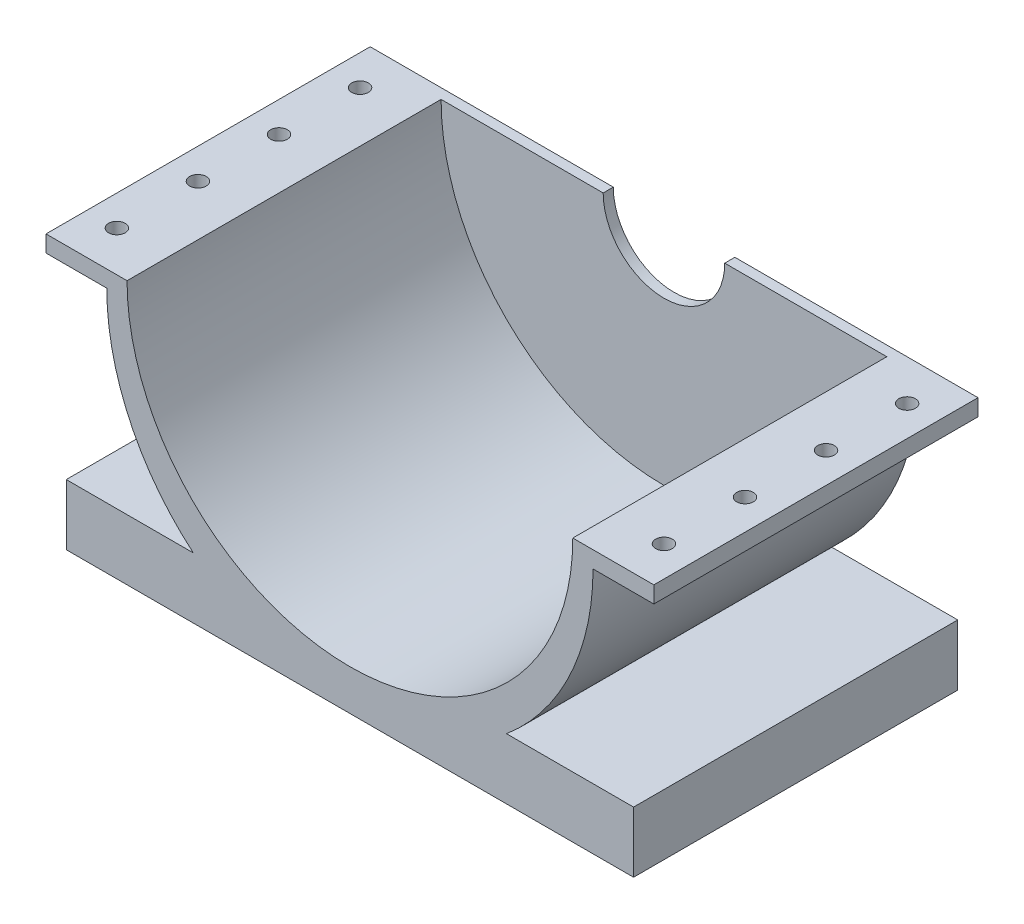
ISO-10303-21;
HEADER;
FILE_DESCRIPTION(('STEP AP214'),'2;1');
FILE_NAME('part.step','',(''),(''),'','','');
FILE_SCHEMA(('AUTOMOTIVE_DESIGN { 1 0 10303 214 1 1 1 1 }'));
ENDSEC;
DATA;
#1=APPLICATION_CONTEXT('core data for automotive mechanical design processes');
#2=APPLICATION_PROTOCOL_DEFINITION('international standard','automotive_design',2000,#1);
#3=PRODUCT_CONTEXT('',#1,'mechanical');
#4=PRODUCT('Part','Part','',(#3));
#5=PRODUCT_RELATED_PRODUCT_CATEGORY('part','',(#4));
#6=PRODUCT_DEFINITION_FORMATION('','',#4);
#7=PRODUCT_DEFINITION_CONTEXT('part definition',#1,'design');
#8=PRODUCT_DEFINITION('design','',#6,#7);
#9=PRODUCT_DEFINITION_SHAPE('','',#8);
#10=(LENGTH_UNIT() NAMED_UNIT(*) SI_UNIT(.MILLI.,.METRE.));
#11=(NAMED_UNIT(*) PLANE_ANGLE_UNIT() SI_UNIT($,.RADIAN.));
#12=(NAMED_UNIT(*) SI_UNIT($,.STERADIAN.) SOLID_ANGLE_UNIT());
#13=UNCERTAINTY_MEASURE_WITH_UNIT(LENGTH_MEASURE(1.E-05),#10,'distance_accuracy_value','');
#14=(GEOMETRIC_REPRESENTATION_CONTEXT(3) GLOBAL_UNCERTAINTY_ASSIGNED_CONTEXT((#13)) GLOBAL_UNIT_ASSIGNED_CONTEXT((#10,
#11,#12)) REPRESENTATION_CONTEXT('',''));
#15=CARTESIAN_POINT('',(0.,0.,0.));
#16=DIRECTION('',(0.,0.,1.));
#17=DIRECTION('',(1.,0.,0.));
#18=AXIS2_PLACEMENT_3D('',#15,#16,#17);
#19=CARTESIAN_POINT('',(7.5,0.41,4.));
#20=DIRECTION('',(0.,-1.,0.));
#21=DIRECTION('',(1.,0.,0.));
#22=AXIS2_PLACEMENT_3D('',#19,#20,#21);
#23=PLANE('',#22);
#24=CARTESIAN_POINT('',(-6.75,0.41,-1.));
#25=DIRECTION('',(0.,-1.,0.));
#26=DIRECTION('',(1.,0.,0.));
#27=AXIS2_PLACEMENT_3D('',#24,#25,#26);
#28=CIRCLE('',#27,0.205000000000001);
#29=CARTESIAN_POINT('',(-6.545,0.41,-1.));
#30=VERTEX_POINT('',#29);
#31=EDGE_CURVE('E233',#30,#30,#28,.T.);
#32=ORIENTED_EDGE('',*,*,#31,.T.);
#33=EDGE_LOOP('',(#32));
#34=FACE_BOUND('',#33,.T.);
#35=CARTESIAN_POINT('',(-6.75,0.41,1.));
#36=DIRECTION('',(0.,-1.,0.));
#37=DIRECTION('',(1.,0.,0.));
#38=AXIS2_PLACEMENT_3D('',#35,#36,#37);
#39=CIRCLE('',#38,0.205000000000001);
#40=CARTESIAN_POINT('',(-6.545,0.41,1.));
#41=VERTEX_POINT('',#40);
#42=EDGE_CURVE('E573',#41,#41,#39,.T.);
#43=ORIENTED_EDGE('',*,*,#42,.T.);
#44=EDGE_LOOP('',(#43));
#45=FACE_BOUND('',#44,.T.);
#46=CARTESIAN_POINT('',(-6.75,0.41,3.));
#47=DIRECTION('',(0.,-1.,0.));
#48=DIRECTION('',(1.,0.,0.));
#49=AXIS2_PLACEMENT_3D('',#46,#47,#48);
#50=CIRCLE('',#49,0.205000000000001);
#51=CARTESIAN_POINT('',(-6.545,0.41,3.));
#52=VERTEX_POINT('',#51);
#53=EDGE_CURVE('E246',#52,#52,#50,.T.);
#54=ORIENTED_EDGE('',*,*,#53,.T.);
#55=EDGE_LOOP('',(#54));
#56=FACE_BOUND('',#55,.T.);
#57=CARTESIAN_POINT('',(-6.75,0.41,-3.));
#58=DIRECTION('',(0.,-1.,0.));
#59=DIRECTION('',(1.,0.,0.));
#60=AXIS2_PLACEMENT_3D('',#57,#58,#59);
#61=CIRCLE('',#60,0.205000000000001);
#62=CARTESIAN_POINT('',(-6.545,0.41,-3.));
#63=VERTEX_POINT('',#62);
#64=EDGE_CURVE('E229',#63,#63,#61,.T.);
#65=ORIENTED_EDGE('',*,*,#64,.T.);
#66=EDGE_LOOP('',(#65));
#67=FACE_BOUND('',#66,.T.);
#68=DIRECTION('',(-1.,0.,0.));
#69=VECTOR('',#68,1.);
#70=CARTESIAN_POINT('',(-5.5,0.41,-3.75));
#71=LINE('',#70,#69);
#72=CARTESIAN_POINT('',(-1.5,0.41,-3.75));
#73=VERTEX_POINT('',#72);
#74=CARTESIAN_POINT('',(-5.5,0.41,-3.75));
#75=VERTEX_POINT('',#74);
#76=EDGE_CURVE('E161',#73,#75,#71,.T.);
#77=ORIENTED_EDGE('',*,*,#76,.F.);
#78=DIRECTION('',(0.,0.,-1.));
#79=VECTOR('',#78,1.);
#80=CARTESIAN_POINT('',(-1.5,0.409999999999999,3.75));
#81=LINE('',#80,#79);
#82=CARTESIAN_POINT('',(-1.5,0.409999999999999,-4.));
#83=VERTEX_POINT('',#82);
#84=EDGE_CURVE('E49',#73,#83,#81,.T.);
#85=ORIENTED_EDGE('',*,*,#84,.T.);
#86=DIRECTION('',(-1.,0.,0.));
#87=VECTOR('',#86,1.);
#88=CARTESIAN_POINT('',(7.5,0.41,-4.));
#89=LINE('',#88,#87);
#90=CARTESIAN_POINT('',(-7.5,0.409999999999998,-4.));
#91=VERTEX_POINT('',#90);
#92=EDGE_CURVE('E159',#83,#91,#89,.T.);
#93=ORIENTED_EDGE('',*,*,#92,.T.);
#94=DIRECTION('',(0.,0.,-1.));
#95=VECTOR('',#94,1.);
#96=CARTESIAN_POINT('',(-7.5,0.409999999999998,4.));
#97=LINE('',#96,#95);
#98=CARTESIAN_POINT('',(-7.5,0.409999999999998,4.));
#99=VERTEX_POINT('',#98);
#100=EDGE_CURVE('E215',#99,#91,#97,.T.);
#101=ORIENTED_EDGE('',*,*,#100,.F.);
#102=DIRECTION('',(-1.,0.,0.));
#103=VECTOR('',#102,1.);
#104=CARTESIAN_POINT('',(7.5,0.41,4.));
#105=LINE('',#104,#103);
#106=CARTESIAN_POINT('',(-5.5,0.409999999999998,4.));
#107=VERTEX_POINT('',#106);
#108=EDGE_CURVE('E290',#107,#99,#105,.T.);
#109=ORIENTED_EDGE('',*,*,#108,.F.);
#110=DIRECTION('',(0.,0.,1.));
#111=VECTOR('',#110,1.);
#112=CARTESIAN_POINT('',(-5.5,0.41,-3.75));
#113=LINE('',#112,#111);
#114=EDGE_CURVE('E57',#75,#107,#113,.T.);
#115=ORIENTED_EDGE('',*,*,#114,.F.);
#116=EDGE_LOOP('',(#77,#85,#93,#101,#109,#115));
#117=FACE_BOUND('',#116,.T.);
#118=ADVANCED_FACE('F33',(#34,#45,#56,#67,#117),#23,.F.);
#119=CARTESIAN_POINT('',(0.,0.,4.));
#120=DIRECTION('',(0.,0.,-1.));
#121=DIRECTION('',(-1.,0.,0.));
#122=AXIS2_PLACEMENT_3D('',#119,#120,#121);
#123=CYLINDRICAL_SURFACE('',#122,6.);
#124=CARTESIAN_POINT('',(0.,0.,-4.));
#125=DIRECTION('',(0.,0.,1.));
#126=DIRECTION('',(1.,0.,0.));
#127=AXIS2_PLACEMENT_3D('',#124,#125,#126);
#128=CIRCLE('',#127,6.);
#129=CARTESIAN_POINT('',(3.8641816727478,-4.59,-4.));
#130=VERTEX_POINT('',#129);
#131=CARTESIAN_POINT('',(6.,0.,-4.));
#132=VERTEX_POINT('',#131);
#133=EDGE_CURVE('E281',#130,#132,#128,.T.);
#134=ORIENTED_EDGE('',*,*,#133,.T.);
#135=DIRECTION('',(0.,0.,-1.));
#136=VECTOR('',#135,1.);
#137=CARTESIAN_POINT('',(6.,0.,4.));
#138=LINE('',#137,#136);
#139=CARTESIAN_POINT('',(6.,0.,4.));
#140=VERTEX_POINT('',#139);
#141=EDGE_CURVE('E42',#140,#132,#138,.T.);
#142=ORIENTED_EDGE('',*,*,#141,.F.);
#143=CARTESIAN_POINT('',(0.,0.,4.));
#144=DIRECTION('',(0.,0.,1.));
#145=DIRECTION('',(1.,0.,0.));
#146=AXIS2_PLACEMENT_3D('',#143,#144,#145);
#147=CIRCLE('',#146,6.);
#148=CARTESIAN_POINT('',(3.8641816727478,-4.59,4.));
#149=VERTEX_POINT('',#148);
#150=EDGE_CURVE('E189',#149,#140,#147,.T.);
#151=ORIENTED_EDGE('',*,*,#150,.F.);
#152=DIRECTION('',(0.,0.,-1.));
#153=VECTOR('',#152,1.);
#154=CARTESIAN_POINT('',(3.8641816727478,-4.59,4.));
#155=LINE('',#154,#153);
#156=EDGE_CURVE('E190',#149,#130,#155,.T.);
#157=ORIENTED_EDGE('',*,*,#156,.T.);
#158=EDGE_LOOP('',(#134,#142,#151,#157));
#159=FACE_BOUND('',#158,.T.);
#160=ADVANCED_FACE('F35',(#159),#123,.T.);
#161=CARTESIAN_POINT('',(7.5,0.,4.));
#162=DIRECTION('',(0.,1.,0.));
#163=DIRECTION('',(-1.,0.,0.));
#164=AXIS2_PLACEMENT_3D('',#161,#162,#163);
#165=PLANE('',#164);
#166=CARTESIAN_POINT('',(6.75,0.,-1.));
#167=DIRECTION('',(0.,1.,0.));
#168=DIRECTION('',(-1.,0.,0.));
#169=AXIS2_PLACEMENT_3D('',#166,#167,#168);
#170=CIRCLE('',#169,0.205000000000001);
#171=CARTESIAN_POINT('',(6.545,0.,-1.));
#172=VERTEX_POINT('',#171);
#173=EDGE_CURVE('E262',#172,#172,#170,.T.);
#174=ORIENTED_EDGE('',*,*,#173,.T.);
#175=EDGE_LOOP('',(#174));
#176=FACE_BOUND('',#175,.T.);
#177=CARTESIAN_POINT('',(6.75,0.,1.));
#178=DIRECTION('',(0.,1.,0.));
#179=DIRECTION('',(-1.,0.,0.));
#180=AXIS2_PLACEMENT_3D('',#177,#178,#179);
#181=CIRCLE('',#180,0.205000000000001);
#182=CARTESIAN_POINT('',(6.545,0.,1.));
#183=VERTEX_POINT('',#182);
#184=EDGE_CURVE('E259',#183,#183,#181,.T.);
#185=ORIENTED_EDGE('',*,*,#184,.T.);
#186=EDGE_LOOP('',(#185));
#187=FACE_BOUND('',#186,.T.);
#188=CARTESIAN_POINT('',(6.75,0.,3.));
#189=DIRECTION('',(0.,1.,0.));
#190=DIRECTION('',(-1.,0.,0.));
#191=AXIS2_PLACEMENT_3D('',#188,#189,#190);
#192=CIRCLE('',#191,0.205000000000001);
#193=CARTESIAN_POINT('',(6.545,0.,3.));
#194=VERTEX_POINT('',#193);
#195=EDGE_CURVE('E251',#194,#194,#192,.T.);
#196=ORIENTED_EDGE('',*,*,#195,.T.);
#197=EDGE_LOOP('',(#196));
#198=FACE_BOUND('',#197,.T.);
#199=CARTESIAN_POINT('',(6.75,0.,-3.));
#200=DIRECTION('',(0.,1.,0.));
#201=DIRECTION('',(-1.,0.,0.));
#202=AXIS2_PLACEMENT_3D('',#199,#200,#201);
#203=CIRCLE('',#202,0.205000000000001);
#204=CARTESIAN_POINT('',(6.545,0.,-3.));
#205=VERTEX_POINT('',#204);
#206=EDGE_CURVE('E154',#205,#205,#203,.T.);
#207=ORIENTED_EDGE('',*,*,#206,.T.);
#208=EDGE_LOOP('',(#207));
#209=FACE_BOUND('',#208,.T.);
#210=DIRECTION('',(1.,0.,0.));
#211=VECTOR('',#210,1.);
#212=CARTESIAN_POINT('',(7.5,0.,-4.));
#213=LINE('',#212,#211);
#214=CARTESIAN_POINT('',(7.5,0.,-4.));
#215=VERTEX_POINT('',#214);
#216=EDGE_CURVE('E170',#132,#215,#213,.T.);
#217=ORIENTED_EDGE('',*,*,#216,.T.);
#218=DIRECTION('',(0.,0.,-1.));
#219=VECTOR('',#218,1.);
#220=CARTESIAN_POINT('',(7.5,0.,4.));
#221=LINE('',#220,#219);
#222=CARTESIAN_POINT('',(7.5,0.,4.));
#223=VERTEX_POINT('',#222);
#224=EDGE_CURVE('E220',#223,#215,#221,.T.);
#225=ORIENTED_EDGE('',*,*,#224,.F.);
#226=DIRECTION('',(1.,0.,0.));
#227=VECTOR('',#226,1.);
#228=CARTESIAN_POINT('',(7.5,0.,4.));
#229=LINE('',#228,#227);
#230=EDGE_CURVE('E286',#140,#223,#229,.T.);
#231=ORIENTED_EDGE('',*,*,#230,.F.);
#232=ORIENTED_EDGE('',*,*,#141,.T.);
#233=EDGE_LOOP('',(#217,#225,#231,#232));
#234=FACE_BOUND('',#233,.T.);
#235=ADVANCED_FACE('F312',(#176,#187,#198,#209,#234),#165,.F.);
#236=CARTESIAN_POINT('',(7.5,0.41,4.));
#237=DIRECTION('',(-1.,0.,0.));
#238=DIRECTION('',(0.,0.,1.));
#239=AXIS2_PLACEMENT_3D('',#236,#237,#238);
#240=PLANE('',#239);
#241=DIRECTION('',(0.,1.,0.));
#242=VECTOR('',#241,1.);
#243=CARTESIAN_POINT('',(7.5,0.41,-4.));
#244=LINE('',#243,#242);
#245=CARTESIAN_POINT('',(7.5,0.41,-4.));
#246=VERTEX_POINT('',#245);
#247=EDGE_CURVE('E168',#215,#246,#244,.T.);
#248=ORIENTED_EDGE('',*,*,#247,.T.);
#249=DIRECTION('',(0.,0.,-1.));
#250=VECTOR('',#249,1.);
#251=CARTESIAN_POINT('',(7.5,0.41,4.));
#252=LINE('',#251,#250);
#253=CARTESIAN_POINT('',(7.5,0.41,4.));
#254=VERTEX_POINT('',#253);
#255=EDGE_CURVE('E217',#254,#246,#252,.T.);
#256=ORIENTED_EDGE('',*,*,#255,.F.);
#257=DIRECTION('',(0.,1.,0.));
#258=VECTOR('',#257,1.);
#259=CARTESIAN_POINT('',(7.5,0.41,4.));
#260=LINE('',#259,#258);
#261=EDGE_CURVE('E288',#223,#254,#260,.T.);
#262=ORIENTED_EDGE('',*,*,#261,.F.);
#263=ORIENTED_EDGE('',*,*,#224,.T.);
#264=EDGE_LOOP('',(#248,#256,#262,#263));
#265=FACE_BOUND('',#264,.T.);
#266=ADVANCED_FACE('F318',(#265),#240,.F.);
#267=CARTESIAN_POINT('',(6.75,0.41,-1.));
#268=DIRECTION('',(0.,1.,0.));
#269=DIRECTION('',(-1.,0.,0.));
#270=AXIS2_PLACEMENT_3D('',#267,#268,#269);
#271=CIRCLE('',#270,0.205000000000001);
#272=CARTESIAN_POINT('',(6.545,0.41,-1.));
#273=VERTEX_POINT('',#272);
#274=EDGE_CURVE('E248',#273,#273,#271,.T.);
#275=ORIENTED_EDGE('',*,*,#274,.F.);
#276=EDGE_LOOP('',(#275));
#277=FACE_BOUND('',#276,.T.);
#278=CARTESIAN_POINT('',(6.75,0.41,1.));
#279=DIRECTION('',(0.,1.,0.));
#280=DIRECTION('',(-1.,0.,0.));
#281=AXIS2_PLACEMENT_3D('',#278,#279,#280);
#282=CIRCLE('',#281,0.205000000000001);
#283=CARTESIAN_POINT('',(6.545,0.41,1.));
#284=VERTEX_POINT('',#283);
#285=EDGE_CURVE('E252',#284,#284,#282,.T.);
#286=ORIENTED_EDGE('',*,*,#285,.F.);
#287=EDGE_LOOP('',(#286));
#288=FACE_BOUND('',#287,.T.);
#289=CARTESIAN_POINT('',(6.75,0.41,3.));
#290=DIRECTION('',(0.,1.,0.));
#291=DIRECTION('',(-1.,0.,0.));
#292=AXIS2_PLACEMENT_3D('',#289,#290,#291);
#293=CIRCLE('',#292,0.205000000000001);
#294=CARTESIAN_POINT('',(6.545,0.41,3.));
#295=VERTEX_POINT('',#294);
#296=EDGE_CURVE('E228',#295,#295,#293,.T.);
#297=ORIENTED_EDGE('',*,*,#296,.F.);
#298=EDGE_LOOP('',(#297));
#299=FACE_BOUND('',#298,.T.);
#300=CARTESIAN_POINT('',(6.75,0.41,-3.));
#301=DIRECTION('',(0.,1.,0.));
#302=DIRECTION('',(-1.,0.,0.));
#303=AXIS2_PLACEMENT_3D('',#300,#301,#302);
#304=CIRCLE('',#303,0.205000000000001);
#305=CARTESIAN_POINT('',(6.545,0.41,-3.));
#306=VERTEX_POINT('',#305);
#307=EDGE_CURVE('E265',#306,#306,#304,.T.);
#308=ORIENTED_EDGE('',*,*,#307,.F.);
#309=EDGE_LOOP('',(#308));
#310=FACE_BOUND('',#309,.T.);
#311=CARTESIAN_POINT('',(1.5,0.409999999999999,-4.));
#312=VERTEX_POINT('',#311);
#313=EDGE_CURVE('E167',#246,#312,#89,.T.);
#314=ORIENTED_EDGE('',*,*,#313,.T.);
#315=DIRECTION('',(0.,0.,-1.));
#316=VECTOR('',#315,1.);
#317=CARTESIAN_POINT('',(1.5,0.409999999999999,3.75));
#318=LINE('',#317,#316);
#319=CARTESIAN_POINT('',(1.5,0.409999999999999,-3.75));
#320=VERTEX_POINT('',#319);
#321=EDGE_CURVE('E149',#320,#312,#318,.T.);
#322=ORIENTED_EDGE('',*,*,#321,.F.);
#323=CARTESIAN_POINT('',(5.5,0.41,-3.75));
#324=VERTEX_POINT('',#323);
#325=EDGE_CURVE('E275',#324,#320,#71,.T.);
#326=ORIENTED_EDGE('',*,*,#325,.F.);
#327=DIRECTION('',(0.,0.,1.));
#328=VECTOR('',#327,1.);
#329=CARTESIAN_POINT('',(5.5,0.41,-3.75));
#330=LINE('',#329,#328);
#331=CARTESIAN_POINT('',(5.5,0.41,4.));
#332=VERTEX_POINT('',#331);
#333=EDGE_CURVE('E278',#324,#332,#330,.T.);
#334=ORIENTED_EDGE('',*,*,#333,.T.);
#335=EDGE_CURVE('E291',#254,#332,#105,.T.);
#336=ORIENTED_EDGE('',*,*,#335,.F.);
#337=ORIENTED_EDGE('',*,*,#255,.T.);
#338=EDGE_LOOP('',(#314,#322,#326,#334,#336,#337));
#339=FACE_BOUND('',#338,.T.);
#340=ADVANCED_FACE('F321',(#277,#288,#299,#310,#339),#23,.F.);
#341=CARTESIAN_POINT('',(-7.5,0.409999999999998,4.));
#342=DIRECTION('',(1.,0.,0.));
#343=DIRECTION('',(0.,1.,0.));
#344=AXIS2_PLACEMENT_3D('',#341,#342,#343);
#345=PLANE('',#344);
#346=DIRECTION('',(0.,-1.,0.));
#347=VECTOR('',#346,1.);
#348=CARTESIAN_POINT('',(-7.5,0.409999999999998,-4.));
#349=LINE('',#348,#347);
#350=CARTESIAN_POINT('',(-7.5,0.,-4.));
#351=VERTEX_POINT('',#350);
#352=EDGE_CURVE('E166',#91,#351,#349,.T.);
#353=ORIENTED_EDGE('',*,*,#352,.T.);
#354=DIRECTION('',(0.,0.,-1.));
#355=VECTOR('',#354,1.);
#356=CARTESIAN_POINT('',(-7.5,0.,4.));
#357=LINE('',#356,#355);
#358=CARTESIAN_POINT('',(-7.5,0.,4.));
#359=VERTEX_POINT('',#358);
#360=EDGE_CURVE('E212',#359,#351,#357,.T.);
#361=ORIENTED_EDGE('',*,*,#360,.F.);
#362=DIRECTION('',(0.,-1.,0.));
#363=VECTOR('',#362,1.);
#364=CARTESIAN_POINT('',(-7.5,0.409999999999998,4.));
#365=LINE('',#364,#363);
#366=EDGE_CURVE('E294',#99,#359,#365,.T.);
#367=ORIENTED_EDGE('',*,*,#366,.F.);
#368=ORIENTED_EDGE('',*,*,#100,.T.);
#369=EDGE_LOOP('',(#353,#361,#367,#368));
#370=FACE_BOUND('',#369,.T.);
#371=ADVANCED_FACE('F366',(#370),#345,.F.);
#372=CARTESIAN_POINT('',(-6.,0.,4.));
#373=DIRECTION('',(0.,1.,0.));
#374=DIRECTION('',(-1.,0.,0.));
#375=AXIS2_PLACEMENT_3D('',#372,#373,#374);
#376=PLANE('',#375);
#377=CARTESIAN_POINT('',(-6.75,0.,-1.));
#378=DIRECTION('',(0.,1.,0.));
#379=DIRECTION('',(-1.,0.,0.));
#380=AXIS2_PLACEMENT_3D('',#377,#378,#379);
#381=CIRCLE('',#380,0.205000000000001);
#382=CARTESIAN_POINT('',(-6.955,0.,-1.));
#383=VERTEX_POINT('',#382);
#384=EDGE_CURVE('E37',#383,#383,#381,.F.);
#385=ORIENTED_EDGE('',*,*,#384,.F.);
#386=EDGE_LOOP('',(#385));
#387=FACE_BOUND('',#386,.T.);
#388=CARTESIAN_POINT('',(-6.75,0.,1.));
#389=DIRECTION('',(0.,1.,0.));
#390=DIRECTION('',(-1.,0.,0.));
#391=AXIS2_PLACEMENT_3D('',#388,#389,#390);
#392=CIRCLE('',#391,0.205000000000001);
#393=CARTESIAN_POINT('',(-6.955,0.,1.));
#394=VERTEX_POINT('',#393);
#395=EDGE_CURVE('E232',#394,#394,#392,.F.);
#396=ORIENTED_EDGE('',*,*,#395,.F.);
#397=EDGE_LOOP('',(#396));
#398=FACE_BOUND('',#397,.T.);
#399=CARTESIAN_POINT('',(-6.75,0.,3.));
#400=DIRECTION('',(0.,1.,0.));
#401=DIRECTION('',(-1.,0.,0.));
#402=AXIS2_PLACEMENT_3D('',#399,#400,#401);
#403=CIRCLE('',#402,0.205000000000001);
#404=CARTESIAN_POINT('',(-6.955,0.,3.));
#405=VERTEX_POINT('',#404);
#406=EDGE_CURVE('E230',#405,#405,#403,.F.);
#407=ORIENTED_EDGE('',*,*,#406,.F.);
#408=EDGE_LOOP('',(#407));
#409=FACE_BOUND('',#408,.T.);
#410=CARTESIAN_POINT('',(-6.75,0.,-3.));
#411=DIRECTION('',(0.,1.,0.));
#412=DIRECTION('',(-1.,0.,0.));
#413=AXIS2_PLACEMENT_3D('',#410,#411,#412);
#414=CIRCLE('',#413,0.205000000000001);
#415=CARTESIAN_POINT('',(-6.955,0.,-3.));
#416=VERTEX_POINT('',#415);
#417=EDGE_CURVE('E225',#416,#416,#414,.F.);
#418=ORIENTED_EDGE('',*,*,#417,.F.);
#419=EDGE_LOOP('',(#418));
#420=FACE_BOUND('',#419,.T.);
#421=DIRECTION('',(1.,0.,0.));
#422=VECTOR('',#421,1.);
#423=CARTESIAN_POINT('',(-6.,0.,-4.));
#424=LINE('',#423,#422);
#425=CARTESIAN_POINT('',(-6.,0.,-4.));
#426=VERTEX_POINT('',#425);
#427=EDGE_CURVE('E175',#351,#426,#424,.T.);
#428=ORIENTED_EDGE('',*,*,#427,.T.);
#429=DIRECTION('',(0.,0.,-1.));
#430=VECTOR('',#429,1.);
#431=CARTESIAN_POINT('',(-6.,0.,4.));
#432=LINE('',#431,#430);
#433=CARTESIAN_POINT('',(-6.,0.,4.));
#434=VERTEX_POINT('',#433);
#435=EDGE_CURVE('E209',#434,#426,#432,.T.);
#436=ORIENTED_EDGE('',*,*,#435,.F.);
#437=DIRECTION('',(1.,0.,0.));
#438=VECTOR('',#437,1.);
#439=CARTESIAN_POINT('',(-6.,0.,4.));
#440=LINE('',#439,#438);
#441=EDGE_CURVE('E296',#359,#434,#440,.T.);
#442=ORIENTED_EDGE('',*,*,#441,.F.);
#443=ORIENTED_EDGE('',*,*,#360,.T.);
#444=EDGE_LOOP('',(#428,#436,#442,#443));
#445=FACE_BOUND('',#444,.T.);
#446=ADVANCED_FACE('F361',(#387,#398,#409,#420,#445),#376,.F.);
#447=CARTESIAN_POINT('',(0.,0.,4.));
#448=DIRECTION('',(0.,0.,-1.));
#449=DIRECTION('',(-1.,0.,0.));
#450=AXIS2_PLACEMENT_3D('',#447,#448,#449);
#451=CYLINDRICAL_SURFACE('',#450,6.);
#452=CARTESIAN_POINT('',(0.,0.,-4.));
#453=DIRECTION('',(0.,0.,1.));
#454=DIRECTION('',(1.,0.,0.));
#455=AXIS2_PLACEMENT_3D('',#452,#453,#454);
#456=CIRCLE('',#455,6.);
#457=CARTESIAN_POINT('',(-3.86418167274781,-4.59,-4.));
#458=VERTEX_POINT('',#457);
#459=EDGE_CURVE('E177',#426,#458,#456,.T.);
#460=ORIENTED_EDGE('',*,*,#459,.T.);
#461=DIRECTION('',(0.,0.,-1.));
#462=VECTOR('',#461,1.);
#463=CARTESIAN_POINT('',(-3.86418167274781,-4.59,4.));
#464=LINE('',#463,#462);
#465=CARTESIAN_POINT('',(-3.86418167274781,-4.59,4.));
#466=VERTEX_POINT('',#465);
#467=EDGE_CURVE('E206',#466,#458,#464,.T.);
#468=ORIENTED_EDGE('',*,*,#467,.F.);
#469=CARTESIAN_POINT('',(0.,0.,4.));
#470=DIRECTION('',(0.,0.,1.));
#471=DIRECTION('',(1.,0.,0.));
#472=AXIS2_PLACEMENT_3D('',#469,#470,#471);
#473=CIRCLE('',#472,6.);
#474=EDGE_CURVE('E298',#434,#466,#473,.T.);
#475=ORIENTED_EDGE('',*,*,#474,.F.);
#476=ORIENTED_EDGE('',*,*,#435,.T.);
#477=EDGE_LOOP('',(#460,#468,#475,#476));
#478=FACE_BOUND('',#477,.T.);
#479=ADVANCED_FACE('F358',(#478),#451,.T.);
#480=CARTESIAN_POINT('',(-7.,-4.59,4.));
#481=DIRECTION('',(0.,-1.,0.));
#482=DIRECTION('',(1.,0.,0.));
#483=AXIS2_PLACEMENT_3D('',#480,#481,#482);
#484=PLANE('',#483);
#485=DIRECTION('',(-1.,0.,0.));
#486=VECTOR('',#485,1.);
#487=CARTESIAN_POINT('',(-7.,-4.59,-4.));
#488=LINE('',#487,#486);
#489=CARTESIAN_POINT('',(-7.,-4.59,-4.));
#490=VERTEX_POINT('',#489);
#491=EDGE_CURVE('E179',#458,#490,#488,.T.);
#492=ORIENTED_EDGE('',*,*,#491,.T.);
#493=DIRECTION('',(0.,0.,-1.));
#494=VECTOR('',#493,1.);
#495=CARTESIAN_POINT('',(-7.,-4.59,4.));
#496=LINE('',#495,#494);
#497=CARTESIAN_POINT('',(-7.,-4.59,4.));
#498=VERTEX_POINT('',#497);
#499=EDGE_CURVE('E203',#498,#490,#496,.T.);
#500=ORIENTED_EDGE('',*,*,#499,.F.);
#501=DIRECTION('',(-1.,0.,0.));
#502=VECTOR('',#501,1.);
#503=CARTESIAN_POINT('',(-7.,-4.59,4.));
#504=LINE('',#503,#502);
#505=EDGE_CURVE('E300',#466,#498,#504,.T.);
#506=ORIENTED_EDGE('',*,*,#505,.F.);
#507=ORIENTED_EDGE('',*,*,#467,.T.);
#508=EDGE_LOOP('',(#492,#500,#506,#507));
#509=FACE_BOUND('',#508,.T.);
#510=ADVANCED_FACE('F354',(#509),#484,.F.);
#511=CARTESIAN_POINT('',(-7.,-4.59,4.));
#512=DIRECTION('',(1.,0.,0.));
#513=DIRECTION('',(0.,0.,-1.));
#514=AXIS2_PLACEMENT_3D('',#511,#512,#513);
#515=PLANE('',#514);
#516=DIRECTION('',(0.,-1.,0.));
#517=VECTOR('',#516,1.);
#518=CARTESIAN_POINT('',(-7.,-4.59,-4.));
#519=LINE('',#518,#517);
#520=CARTESIAN_POINT('',(-7.,-6.09,-4.));
#521=VERTEX_POINT('',#520);
#522=EDGE_CURVE('E181',#490,#521,#519,.T.);
#523=ORIENTED_EDGE('',*,*,#522,.T.);
#524=DIRECTION('',(0.,0.,-1.));
#525=VECTOR('',#524,1.);
#526=CARTESIAN_POINT('',(-7.,-6.09,4.));
#527=LINE('',#526,#525);
#528=CARTESIAN_POINT('',(-7.,-6.09,4.));
#529=VERTEX_POINT('',#528);
#530=EDGE_CURVE('E200',#529,#521,#527,.T.);
#531=ORIENTED_EDGE('',*,*,#530,.F.);
#532=DIRECTION('',(0.,-1.,0.));
#533=VECTOR('',#532,1.);
#534=CARTESIAN_POINT('',(-7.,-4.59,4.));
#535=LINE('',#534,#533);
#536=EDGE_CURVE('E302',#498,#529,#535,.T.);
#537=ORIENTED_EDGE('',*,*,#536,.F.);
#538=ORIENTED_EDGE('',*,*,#499,.T.);
#539=EDGE_LOOP('',(#523,#531,#537,#538));
#540=FACE_BOUND('',#539,.T.);
#541=ADVANCED_FACE('F349',(#540),#515,.F.);
#542=CARTESIAN_POINT('',(-7.,-6.09,4.));
#543=DIRECTION('',(0.,1.,0.));
#544=DIRECTION('',(0.,0.,1.));
#545=AXIS2_PLACEMENT_3D('',#542,#543,#544);
#546=PLANE('',#545);
#547=DIRECTION('',(1.,0.,0.));
#548=VECTOR('',#547,1.);
#549=CARTESIAN_POINT('',(-7.,-6.09,-4.));
#550=LINE('',#549,#548);
#551=CARTESIAN_POINT('',(7.,-6.09,-4.));
#552=VERTEX_POINT('',#551);
#553=EDGE_CURVE('E183',#521,#552,#550,.T.);
#554=ORIENTED_EDGE('',*,*,#553,.T.);
#555=DIRECTION('',(0.,0.,-1.));
#556=VECTOR('',#555,1.);
#557=CARTESIAN_POINT('',(7.,-6.09,4.));
#558=LINE('',#557,#556);
#559=CARTESIAN_POINT('',(7.,-6.09,4.));
#560=VERTEX_POINT('',#559);
#561=EDGE_CURVE('E197',#560,#552,#558,.T.);
#562=ORIENTED_EDGE('',*,*,#561,.F.);
#563=DIRECTION('',(1.,0.,0.));
#564=VECTOR('',#563,1.);
#565=CARTESIAN_POINT('',(-7.,-6.09,4.));
#566=LINE('',#565,#564);
#567=EDGE_CURVE('E304',#529,#560,#566,.T.);
#568=ORIENTED_EDGE('',*,*,#567,.F.);
#569=ORIENTED_EDGE('',*,*,#530,.T.);
#570=EDGE_LOOP('',(#554,#562,#568,#569));
#571=FACE_BOUND('',#570,.T.);
#572=ADVANCED_FACE('F343',(#571),#546,.F.);
#573=CARTESIAN_POINT('',(7.,-4.59,4.));
#574=DIRECTION('',(-1.,0.,0.));
#575=DIRECTION('',(0.,-1.,0.));
#576=AXIS2_PLACEMENT_3D('',#573,#574,#575);
#577=PLANE('',#576);
#578=DIRECTION('',(0.,1.,0.));
#579=VECTOR('',#578,1.);
#580=CARTESIAN_POINT('',(7.,-4.59,-4.));
#581=LINE('',#580,#579);
#582=CARTESIAN_POINT('',(7.,-4.59,-4.));
#583=VERTEX_POINT('',#582);
#584=EDGE_CURVE('E185',#552,#583,#581,.T.);
#585=ORIENTED_EDGE('',*,*,#584,.T.);
#586=DIRECTION('',(0.,0.,-1.));
#587=VECTOR('',#586,1.);
#588=CARTESIAN_POINT('',(7.,-4.59,4.));
#589=LINE('',#588,#587);
#590=CARTESIAN_POINT('',(7.,-4.59,4.));
#591=VERTEX_POINT('',#590);
#592=EDGE_CURVE('E193',#591,#583,#589,.T.);
#593=ORIENTED_EDGE('',*,*,#592,.F.);
#594=DIRECTION('',(0.,1.,0.));
#595=VECTOR('',#594,1.);
#596=CARTESIAN_POINT('',(7.,-4.59,4.));
#597=LINE('',#596,#595);
#598=EDGE_CURVE('E306',#560,#591,#597,.T.);
#599=ORIENTED_EDGE('',*,*,#598,.F.);
#600=ORIENTED_EDGE('',*,*,#561,.T.);
#601=EDGE_LOOP('',(#585,#593,#599,#600));
#602=FACE_BOUND('',#601,.T.);
#603=ADVANCED_FACE('F339',(#602),#577,.F.);
#604=CARTESIAN_POINT('',(3.8641816727478,-4.59,4.));
#605=DIRECTION('',(0.,-1.,0.));
#606=DIRECTION('',(1.,0.,0.));
#607=AXIS2_PLACEMENT_3D('',#604,#605,#606);
#608=PLANE('',#607);
#609=DIRECTION('',(-1.,0.,0.));
#610=VECTOR('',#609,1.);
#611=CARTESIAN_POINT('',(3.8641816727478,-4.59,-4.));
#612=LINE('',#611,#610);
#613=EDGE_CURVE('E187',#583,#130,#612,.T.);
#614=ORIENTED_EDGE('',*,*,#613,.T.);
#615=ORIENTED_EDGE('',*,*,#156,.F.);
#616=DIRECTION('',(-1.,0.,0.));
#617=VECTOR('',#616,1.);
#618=CARTESIAN_POINT('',(3.8641816727478,-4.59,4.));
#619=LINE('',#618,#617);
#620=EDGE_CURVE('E194',#591,#149,#619,.T.);
#621=ORIENTED_EDGE('',*,*,#620,.F.);
#622=ORIENTED_EDGE('',*,*,#592,.T.);
#623=EDGE_LOOP('',(#614,#615,#621,#622));
#624=FACE_BOUND('',#623,.T.);
#625=ADVANCED_FACE('F335',(#624),#608,.F.);
#626=CARTESIAN_POINT('',(0.,0.,4.));
#627=DIRECTION('',(0.,0.,1.));
#628=DIRECTION('',(1.,0.,0.));
#629=AXIS2_PLACEMENT_3D('',#626,#627,#628);
#630=PLANE('',#629);
#631=CARTESIAN_POINT('',(0.,0.409999999999999,4.));
#632=DIRECTION('',(0.,0.,1.));
#633=DIRECTION('',(1.,0.,0.));
#634=AXIS2_PLACEMENT_3D('',#631,#632,#633);
#635=CIRCLE('',#634,5.5);
#636=EDGE_CURVE('E270',#107,#332,#635,.T.);
#637=ORIENTED_EDGE('',*,*,#636,.F.);
#638=ORIENTED_EDGE('',*,*,#108,.T.);
#639=ORIENTED_EDGE('',*,*,#366,.T.);
#640=ORIENTED_EDGE('',*,*,#441,.T.);
#641=ORIENTED_EDGE('',*,*,#474,.T.);
#642=ORIENTED_EDGE('',*,*,#505,.T.);
#643=ORIENTED_EDGE('',*,*,#536,.T.);
#644=ORIENTED_EDGE('',*,*,#567,.T.);
#645=ORIENTED_EDGE('',*,*,#598,.T.);
#646=ORIENTED_EDGE('',*,*,#620,.T.);
#647=ORIENTED_EDGE('',*,*,#150,.T.);
#648=ORIENTED_EDGE('',*,*,#230,.T.);
#649=ORIENTED_EDGE('',*,*,#261,.T.);
#650=ORIENTED_EDGE('',*,*,#335,.T.);
#651=EDGE_LOOP('',(#637,#638,#639,#640,#641,#642,#643,#644,#645,#646,#647,#648,#649,#650));
#652=FACE_BOUND('',#651,.T.);
#653=ADVANCED_FACE('F325',(#652),#630,.T.);
#654=CARTESIAN_POINT('',(0.,0.,-4.));
#655=DIRECTION('',(0.,0.,1.));
#656=DIRECTION('',(1.,0.,0.));
#657=AXIS2_PLACEMENT_3D('',#654,#655,#656);
#658=PLANE('',#657);
#659=ORIENTED_EDGE('',*,*,#92,.F.);
#660=CARTESIAN_POINT('',(0.,0.409999999999999,-4.));
#661=DIRECTION('',(0.,0.,-1.));
#662=DIRECTION('',(-1.,0.,0.));
#663=AXIS2_PLACEMENT_3D('',#660,#661,#662);
#664=CIRCLE('',#663,1.5);
#665=EDGE_CURVE('E146',#312,#83,#664,.T.);
#666=ORIENTED_EDGE('',*,*,#665,.F.);
#667=ORIENTED_EDGE('',*,*,#313,.F.);
#668=ORIENTED_EDGE('',*,*,#247,.F.);
#669=ORIENTED_EDGE('',*,*,#216,.F.);
#670=ORIENTED_EDGE('',*,*,#133,.F.);
#671=ORIENTED_EDGE('',*,*,#613,.F.);
#672=ORIENTED_EDGE('',*,*,#584,.F.);
#673=ORIENTED_EDGE('',*,*,#553,.F.);
#674=ORIENTED_EDGE('',*,*,#522,.F.);
#675=ORIENTED_EDGE('',*,*,#491,.F.);
#676=ORIENTED_EDGE('',*,*,#459,.F.);
#677=ORIENTED_EDGE('',*,*,#427,.F.);
#678=ORIENTED_EDGE('',*,*,#352,.F.);
#679=EDGE_LOOP('',(#659,#666,#667,#668,#669,#670,#671,#672,#673,#674,#675,#676,#677,#678));
#680=FACE_BOUND('',#679,.T.);
#681=ADVANCED_FACE('F164',(#680),#658,.F.);
#682=CARTESIAN_POINT('',(0.,0.409999999999999,-3.75));
#683=DIRECTION('',(0.,0.,1.));
#684=DIRECTION('',(1.,0.,0.));
#685=AXIS2_PLACEMENT_3D('',#682,#683,#684);
#686=CYLINDRICAL_SURFACE('',#685,5.5);
#687=ORIENTED_EDGE('',*,*,#636,.T.);
#688=ORIENTED_EDGE('',*,*,#333,.F.);
#689=CARTESIAN_POINT('',(0.,0.409999999999999,-3.75));
#690=DIRECTION('',(0.,0.,1.));
#691=DIRECTION('',(1.,0.,0.));
#692=AXIS2_PLACEMENT_3D('',#689,#690,#691);
#693=CIRCLE('',#692,5.5);
#694=EDGE_CURVE('E272',#75,#324,#693,.T.);
#695=ORIENTED_EDGE('',*,*,#694,.F.);
#696=ORIENTED_EDGE('',*,*,#114,.T.);
#697=EDGE_LOOP('',(#687,#688,#695,#696));
#698=FACE_BOUND('',#697,.T.);
#699=ADVANCED_FACE('F416',(#698),#686,.F.);
#700=CARTESIAN_POINT('',(0.,0.409999999999999,-3.75));
#701=DIRECTION('',(0.,0.,1.));
#702=DIRECTION('',(1.,0.,0.));
#703=AXIS2_PLACEMENT_3D('',#700,#701,#702);
#704=PLANE('',#703);
#705=CARTESIAN_POINT('',(0.,0.409999999999999,-3.75));
#706=DIRECTION('',(0.,0.,1.));
#707=DIRECTION('',(1.,0.,0.));
#708=AXIS2_PLACEMENT_3D('',#705,#706,#707);
#709=CIRCLE('',#708,1.5);
#710=EDGE_CURVE('E11',#73,#320,#709,.T.);
#711=ORIENTED_EDGE('',*,*,#710,.F.);
#712=ORIENTED_EDGE('',*,*,#76,.T.);
#713=ORIENTED_EDGE('',*,*,#694,.T.);
#714=ORIENTED_EDGE('',*,*,#325,.T.);
#715=EDGE_LOOP('',(#711,#712,#713,#714));
#716=FACE_BOUND('',#715,.T.);
#717=ADVANCED_FACE('F410',(#716),#704,.T.);
#718=CARTESIAN_POINT('',(0.,0.409999999999999,3.75));
#719=DIRECTION('',(0.,0.,-1.));
#720=DIRECTION('',(-1.,0.,0.));
#721=AXIS2_PLACEMENT_3D('',#718,#719,#720);
#722=CYLINDRICAL_SURFACE('',#721,1.5);
#723=ORIENTED_EDGE('',*,*,#710,.T.);
#724=ORIENTED_EDGE('',*,*,#321,.T.);
#725=ORIENTED_EDGE('',*,*,#665,.T.);
#726=ORIENTED_EDGE('',*,*,#84,.F.);
#727=EDGE_LOOP('',(#723,#724,#725,#726));
#728=FACE_BOUND('',#727,.T.);
#729=ADVANCED_FACE('F147',(#728),#722,.F.);
#730=CARTESIAN_POINT('',(6.75,-2.34,-3.));
#731=DIRECTION('',(0.,1.,0.));
#732=DIRECTION('',(-1.,0.,0.));
#733=AXIS2_PLACEMENT_3D('',#730,#731,#732);
#734=CYLINDRICAL_SURFACE('',#733,0.205000000000001);
#735=ORIENTED_EDGE('',*,*,#307,.T.);
#736=EDGE_LOOP('',(#735));
#737=FACE_BOUND('',#736,.T.);
#738=ORIENTED_EDGE('',*,*,#206,.F.);
#739=EDGE_LOOP('',(#738));
#740=FACE_BOUND('',#739,.T.);
#741=ADVANCED_FACE('F398',(#737,#740),#734,.F.);
#742=CARTESIAN_POINT('',(6.75,-2.34,3.));
#743=DIRECTION('',(0.,1.,0.));
#744=DIRECTION('',(-1.,0.,0.));
#745=AXIS2_PLACEMENT_3D('',#742,#743,#744);
#746=CYLINDRICAL_SURFACE('',#745,0.205000000000001);
#747=ORIENTED_EDGE('',*,*,#296,.T.);
#748=EDGE_LOOP('',(#747));
#749=FACE_BOUND('',#748,.T.);
#750=ORIENTED_EDGE('',*,*,#195,.F.);
#751=EDGE_LOOP('',(#750));
#752=FACE_BOUND('',#751,.T.);
#753=ADVANCED_FACE('F400',(#749,#752),#746,.F.);
#754=CARTESIAN_POINT('',(6.75,-2.34,1.));
#755=DIRECTION('',(0.,1.,0.));
#756=DIRECTION('',(-1.,0.,0.));
#757=AXIS2_PLACEMENT_3D('',#754,#755,#756);
#758=CYLINDRICAL_SURFACE('',#757,0.205000000000001);
#759=ORIENTED_EDGE('',*,*,#285,.T.);
#760=EDGE_LOOP('',(#759));
#761=FACE_BOUND('',#760,.T.);
#762=ORIENTED_EDGE('',*,*,#184,.F.);
#763=EDGE_LOOP('',(#762));
#764=FACE_BOUND('',#763,.T.);
#765=ADVANCED_FACE('F407',(#761,#764),#758,.F.);
#766=CARTESIAN_POINT('',(6.75,-2.34,-1.));
#767=DIRECTION('',(0.,1.,0.));
#768=DIRECTION('',(-1.,0.,0.));
#769=AXIS2_PLACEMENT_3D('',#766,#767,#768);
#770=CYLINDRICAL_SURFACE('',#769,0.205000000000001);
#771=ORIENTED_EDGE('',*,*,#274,.T.);
#772=EDGE_LOOP('',(#771));
#773=FACE_BOUND('',#772,.T.);
#774=ORIENTED_EDGE('',*,*,#173,.F.);
#775=EDGE_LOOP('',(#774));
#776=FACE_BOUND('',#775,.T.);
#777=ADVANCED_FACE('F512',(#773,#776),#770,.F.);
#778=CARTESIAN_POINT('',(-6.75,-2.34,-3.));
#779=DIRECTION('',(0.,1.,0.));
#780=DIRECTION('',(-1.,0.,0.));
#781=AXIS2_PLACEMENT_3D('',#778,#779,#780);
#782=CYLINDRICAL_SURFACE('',#781,0.205000000000001);
#783=ORIENTED_EDGE('',*,*,#64,.F.);
#784=EDGE_LOOP('',(#783));
#785=FACE_BOUND('',#784,.T.);
#786=ORIENTED_EDGE('',*,*,#417,.T.);
#787=EDGE_LOOP('',(#786));
#788=FACE_BOUND('',#787,.T.);
#789=ADVANCED_FACE('F520',(#785,#788),#782,.F.);
#790=CARTESIAN_POINT('',(-6.75,-2.34,3.));
#791=DIRECTION('',(0.,1.,0.));
#792=DIRECTION('',(-1.,0.,0.));
#793=AXIS2_PLACEMENT_3D('',#790,#791,#792);
#794=CYLINDRICAL_SURFACE('',#793,0.205000000000001);
#795=ORIENTED_EDGE('',*,*,#53,.F.);
#796=EDGE_LOOP('',(#795));
#797=FACE_BOUND('',#796,.T.);
#798=ORIENTED_EDGE('',*,*,#406,.T.);
#799=EDGE_LOOP('',(#798));
#800=FACE_BOUND('',#799,.T.);
#801=ADVANCED_FACE('F538',(#797,#800),#794,.F.);
#802=CARTESIAN_POINT('',(-6.75,-2.34,1.));
#803=DIRECTION('',(0.,1.,0.));
#804=DIRECTION('',(-1.,0.,0.));
#805=AXIS2_PLACEMENT_3D('',#802,#803,#804);
#806=CYLINDRICAL_SURFACE('',#805,0.205000000000001);
#807=ORIENTED_EDGE('',*,*,#42,.F.);
#808=EDGE_LOOP('',(#807));
#809=FACE_BOUND('',#808,.T.);
#810=ORIENTED_EDGE('',*,*,#395,.T.);
#811=EDGE_LOOP('',(#810));
#812=FACE_BOUND('',#811,.T.);
#813=ADVANCED_FACE('F548',(#809,#812),#806,.F.);
#814=CARTESIAN_POINT('',(-6.75,-2.34,-1.));
#815=DIRECTION('',(0.,1.,0.));
#816=DIRECTION('',(-1.,0.,0.));
#817=AXIS2_PLACEMENT_3D('',#814,#815,#816);
#818=CYLINDRICAL_SURFACE('',#817,0.205000000000001);
#819=ORIENTED_EDGE('',*,*,#31,.F.);
#820=EDGE_LOOP('',(#819));
#821=FACE_BOUND('',#820,.T.);
#822=ORIENTED_EDGE('',*,*,#384,.T.);
#823=EDGE_LOOP('',(#822));
#824=FACE_BOUND('',#823,.T.);
#825=ADVANCED_FACE('F558',(#821,#824),#818,.F.);
#826=CLOSED_SHELL('',(#118,#160,#235,#266,#340,#371,#446,#479,#510,#541,#572,#603,#625,#653,
#681,#699,#717,#729,#741,#753,#765,#777,#789,#801,#813,#825));
#827=MANIFOLD_SOLID_BREP('B2',#826);
#828=ADVANCED_BREP_SHAPE_REPRESENTATION('',(#18,#827),#14);
#829=SHAPE_DEFINITION_REPRESENTATION(#9,#828);
ENDSEC;
END-ISO-10303-21;
